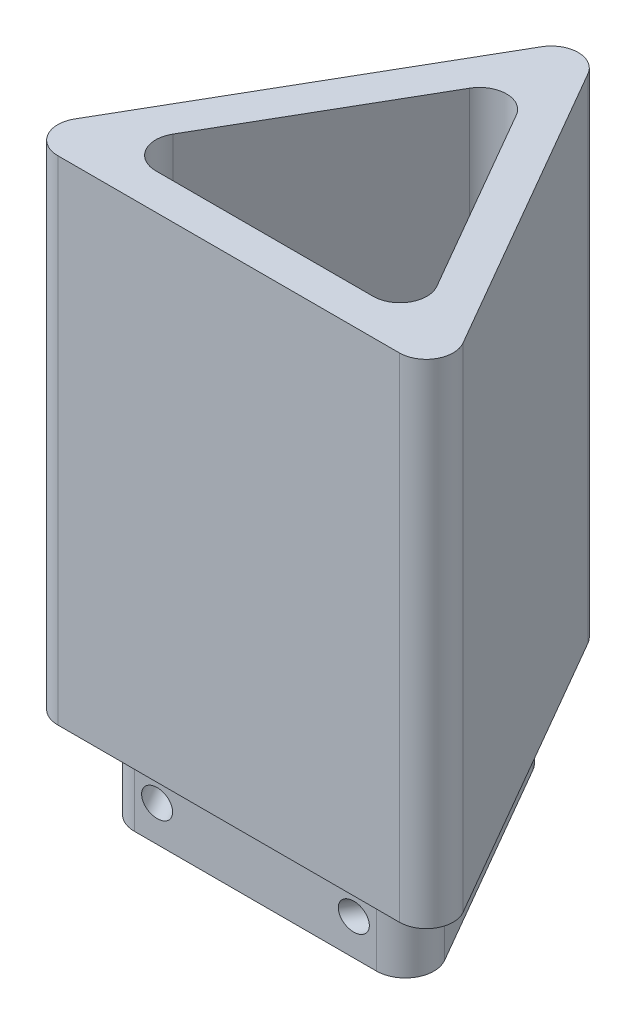
ISO-10303-21;
HEADER;
FILE_DESCRIPTION(('STEP AP214'),'2;1');
FILE_NAME('part.step','',(''),(''),'','','');
FILE_SCHEMA(('AUTOMOTIVE_DESIGN { 1 0 10303 214 1 1 1 1 }'));
ENDSEC;
DATA;
#1=APPLICATION_CONTEXT('core data for automotive mechanical design processes');
#2=APPLICATION_PROTOCOL_DEFINITION('international standard','automotive_design',2000,#1);
#3=PRODUCT_CONTEXT('',#1,'mechanical');
#4=PRODUCT('Part','Part','',(#3));
#5=PRODUCT_RELATED_PRODUCT_CATEGORY('part','',(#4));
#6=PRODUCT_DEFINITION_FORMATION('','',#4);
#7=PRODUCT_DEFINITION_CONTEXT('part definition',#1,'design');
#8=PRODUCT_DEFINITION('design','',#6,#7);
#9=PRODUCT_DEFINITION_SHAPE('','',#8);
#10=(LENGTH_UNIT() NAMED_UNIT(*) SI_UNIT(.MILLI.,.METRE.));
#11=(NAMED_UNIT(*) PLANE_ANGLE_UNIT() SI_UNIT($,.RADIAN.));
#12=(NAMED_UNIT(*) SI_UNIT($,.STERADIAN.) SOLID_ANGLE_UNIT());
#13=UNCERTAINTY_MEASURE_WITH_UNIT(LENGTH_MEASURE(1.E-05),#10,'distance_accuracy_value','');
#14=(GEOMETRIC_REPRESENTATION_CONTEXT(3) GLOBAL_UNCERTAINTY_ASSIGNED_CONTEXT((#13)) GLOBAL_UNIT_ASSIGNED_CONTEXT((#10,
#11,#12)) REPRESENTATION_CONTEXT('',''));
#15=CARTESIAN_POINT('',(0.,0.,0.));
#16=DIRECTION('',(0.,0.,1.));
#17=DIRECTION('',(1.,0.,0.));
#18=AXIS2_PLACEMENT_3D('',#15,#16,#17);
#19=CARTESIAN_POINT('',(0.,14.,0.));
#20=DIRECTION('',(0.,1.,0.));
#21=DIRECTION('',(0.,0.,1.));
#22=AXIS2_PLACEMENT_3D('',#19,#20,#21);
#23=PLANE('',#22);
#24=DIRECTION('',(-0.5,0.,-0.866025403784439));
#25=VECTOR('',#24,1.);
#26=CARTESIAN_POINT('',(-2.59807621135331,14.,-18.5));
#27=LINE('',#26,#25);
#28=CARTESIAN_POINT('',(12.1243556529822,14.,7.));
#29=VERTEX_POINT('',#28);
#30=CARTESIAN_POINT('',(0.,14.,-14.));
#31=VERTEX_POINT('',#30);
#32=EDGE_CURVE('E61',#29,#31,#27,.T.);
#33=ORIENTED_EDGE('',*,*,#32,.T.);
#34=DIRECTION('',(-0.5,0.,0.866025403784439));
#35=VECTOR('',#34,1.);
#36=CARTESIAN_POINT('',(-14.7224318643355,14.,11.5));
#37=LINE('',#36,#35);
#38=CARTESIAN_POINT('',(-12.1243556529821,14.,7.));
#39=VERTEX_POINT('',#38);
#40=EDGE_CURVE('E433',#31,#39,#37,.T.);
#41=ORIENTED_EDGE('',*,*,#40,.T.);
#42=DIRECTION('',(1.,0.,0.));
#43=VECTOR('',#42,1.);
#44=CARTESIAN_POINT('',(17.3205080756888,14.,7.));
#45=LINE('',#44,#43);
#46=EDGE_CURVE('E65',#39,#29,#45,.T.);
#47=ORIENTED_EDGE('',*,*,#46,.T.);
#48=EDGE_LOOP('',(#33,#41,#47));
#49=FACE_BOUND('',#48,.T.);
#50=DIRECTION('',(-0.5,0.,0.866025403784439));
#51=VECTOR('',#50,1.);
#52=CARTESIAN_POINT('',(0.,14.,-12.));
#53=LINE('',#52,#51);
#54=CARTESIAN_POINT('',(0.,14.,-12.));
#55=VERTEX_POINT('',#54);
#56=CARTESIAN_POINT('',(-10.3923048454133,14.,6.));
#57=VERTEX_POINT('',#56);
#58=EDGE_CURVE('E264',#55,#57,#53,.T.);
#59=ORIENTED_EDGE('',*,*,#58,.F.);
#60=DIRECTION('',(-0.500000000000001,0.,-0.866025403784438));
#61=VECTOR('',#60,1.);
#62=CARTESIAN_POINT('',(10.3923048454133,14.,5.99999999999999));
#63=LINE('',#62,#61);
#64=CARTESIAN_POINT('',(10.3923048454133,14.,5.99999999999999));
#65=VERTEX_POINT('',#64);
#66=EDGE_CURVE('E260',#65,#55,#63,.T.);
#67=ORIENTED_EDGE('',*,*,#66,.F.);
#68=DIRECTION('',(1.,0.,0.));
#69=VECTOR('',#68,1.);
#70=CARTESIAN_POINT('',(-10.3923048454133,14.,6.));
#71=LINE('',#70,#69);
#72=EDGE_CURVE('E268',#57,#65,#71,.T.);
#73=ORIENTED_EDGE('',*,*,#72,.F.);
#74=EDGE_LOOP('',(#59,#67,#73));
#75=FACE_BOUND('',#74,.T.);
#76=ADVANCED_FACE('F43',(#49,#75),#23,.T.);
#77=CARTESIAN_POINT('',(0.,0.,0.));
#78=DIRECTION('',(0.,1.,0.));
#79=DIRECTION('',(0.,0.,1.));
#80=AXIS2_PLACEMENT_3D('',#77,#78,#79);
#81=PLANE('',#80);
#82=DIRECTION('',(-0.5,0.,0.866025403784439));
#83=VECTOR('',#82,1.);
#84=CARTESIAN_POINT('',(0.,0.,-22.));
#85=LINE('',#84,#83);
#86=CARTESIAN_POINT('',(-2.7712812921102,0.,-17.2));
#87=VERTEX_POINT('',#86);
#88=CARTESIAN_POINT('',(-16.2812775911475,0.,6.2));
#89=VERTEX_POINT('',#88);
#90=EDGE_CURVE('E324',#87,#89,#85,.T.);
#91=ORIENTED_EDGE('',*,*,#90,.F.);
#92=CARTESIAN_POINT('',(0.,0.,-15.6));
#93=DIRECTION('',(0.,1.,0.));
#94=DIRECTION('',(0.,0.,1.));
#95=AXIS2_PLACEMENT_3D('',#92,#93,#94);
#96=CIRCLE('',#95,3.2);
#97=CARTESIAN_POINT('',(2.7712812921102,0.,-17.2));
#98=VERTEX_POINT('',#97);
#99=EDGE_CURVE('E343',#87,#98,#96,.F.);
#100=ORIENTED_EDGE('',*,*,#99,.T.);
#101=DIRECTION('',(-0.5,0.,-0.866025403784438));
#102=VECTOR('',#101,1.);
#103=CARTESIAN_POINT('',(19.0525588832577,0.,11.));
#104=LINE('',#103,#102);
#105=CARTESIAN_POINT('',(16.2812775911475,0.,6.20000000000001));
#106=VERTEX_POINT('',#105);
#107=EDGE_CURVE('E306',#106,#98,#104,.T.);
#108=ORIENTED_EDGE('',*,*,#107,.F.);
#109=CARTESIAN_POINT('',(13.5099962990373,0.,7.80000000000001));
#110=DIRECTION('',(0.,1.,0.));
#111=DIRECTION('',(0.,0.,1.));
#112=AXIS2_PLACEMENT_3D('',#109,#110,#111);
#113=CIRCLE('',#112,3.2);
#114=CARTESIAN_POINT('',(13.5099962990372,0.,11.));
#115=VERTEX_POINT('',#114);
#116=EDGE_CURVE('E340',#106,#115,#113,.F.);
#117=ORIENTED_EDGE('',*,*,#116,.T.);
#118=DIRECTION('',(1.,0.,0.));
#119=VECTOR('',#118,1.);
#120=CARTESIAN_POINT('',(-19.0525588832577,0.,11.));
#121=LINE('',#120,#119);
#122=CARTESIAN_POINT('',(-13.5099962990372,0.,11.));
#123=VERTEX_POINT('',#122);
#124=EDGE_CURVE('E312',#123,#115,#121,.T.);
#125=ORIENTED_EDGE('',*,*,#124,.F.);
#126=CARTESIAN_POINT('',(-13.5099962990372,0.,7.8));
#127=DIRECTION('',(0.,1.,0.));
#128=DIRECTION('',(0.,0.,1.));
#129=AXIS2_PLACEMENT_3D('',#126,#127,#128);
#130=CIRCLE('',#129,3.2);
#131=EDGE_CURVE('E337',#123,#89,#130,.F.);
#132=ORIENTED_EDGE('',*,*,#131,.T.);
#133=EDGE_LOOP('',(#91,#100,#108,#117,#125,#132));
#134=FACE_BOUND('',#133,.T.);
#135=DIRECTION('',(-0.5,0.,-0.866025403784438));
#136=VECTOR('',#135,1.);
#137=CARTESIAN_POINT('',(10.3923048454133,0.,6.));
#138=LINE('',#137,#136);
#139=CARTESIAN_POINT('',(10.3923048454133,0.,6.));
#140=VERTEX_POINT('',#139);
#141=CARTESIAN_POINT('',(0.,0.,-12.));
#142=VERTEX_POINT('',#141);
#143=EDGE_CURVE('E283',#140,#142,#138,.T.);
#144=ORIENTED_EDGE('',*,*,#143,.T.);
#145=DIRECTION('',(-0.5,0.,0.866025403784439));
#146=VECTOR('',#145,1.);
#147=CARTESIAN_POINT('',(0.,0.,-12.));
#148=LINE('',#147,#146);
#149=CARTESIAN_POINT('',(-10.3923048454133,0.,6.));
#150=VERTEX_POINT('',#149);
#151=EDGE_CURVE('E287',#142,#150,#148,.T.);
#152=ORIENTED_EDGE('',*,*,#151,.T.);
#153=DIRECTION('',(1.,0.,0.));
#154=VECTOR('',#153,1.);
#155=CARTESIAN_POINT('',(-10.3923048454133,0.,6.));
#156=LINE('',#155,#154);
#157=EDGE_CURVE('E291',#150,#140,#156,.T.);
#158=ORIENTED_EDGE('',*,*,#157,.T.);
#159=EDGE_LOOP('',(#144,#152,#158));
#160=FACE_BOUND('',#159,.T.);
#161=ADVANCED_FACE('F517',(#134,#160),#81,.F.);
#162=CARTESIAN_POINT('',(19.0525588832577,9.,11.));
#163=DIRECTION('',(-0.866025403784438,0.,0.5));
#164=DIRECTION('',(0.5,0.,0.866025403784439));
#165=AXIS2_PLACEMENT_3D('',#162,#163,#164);
#166=PLANE('',#165);
#167=CARTESIAN_POINT('',(15.0111069989301,4.,3.99999999999978));
#168=DIRECTION('',(-0.866025403784438,0.,0.5));
#169=DIRECTION('',(0.5,0.,0.866025403784439));
#170=AXIS2_PLACEMENT_3D('',#167,#168,#169);
#171=ELLIPSE('',#170,1.73205080756887,1.5);
#172=CARTESIAN_POINT('',(15.8771324027146,4.,5.49999999999977));
#173=VERTEX_POINT('',#172);
#174=EDGE_CURVE('E251',#173,#173,#171,.T.);
#175=ORIENTED_EDGE('',*,*,#174,.T.);
#176=EDGE_LOOP('',(#175));
#177=FACE_BOUND('',#176,.T.);
#178=CARTESIAN_POINT('',(4.04145188432752,4.,-14.9999999999998));
#179=DIRECTION('',(-0.866025403784438,0.,0.5));
#180=DIRECTION('',(0.5,0.,0.866025403784439));
#181=AXIS2_PLACEMENT_3D('',#178,#179,#180);
#182=ELLIPSE('',#181,1.73205080756888,1.5);
#183=CARTESIAN_POINT('',(4.90747728811196,4.,-13.4999999999998));
#184=VERTEX_POINT('',#183);
#185=EDGE_CURVE('E256',#184,#184,#182,.T.);
#186=ORIENTED_EDGE('',*,*,#185,.T.);
#187=EDGE_LOOP('',(#186));
#188=FACE_BOUND('',#187,.T.);
#189=ORIENTED_EDGE('',*,*,#107,.T.);
#190=DIRECTION('',(0.,-1.,0.));
#191=VECTOR('',#190,1.);
#192=CARTESIAN_POINT('',(2.7712812921102,9.,-17.2));
#193=LINE('',#192,#191);
#194=CARTESIAN_POINT('',(2.7712812921102,9.,-17.2));
#195=VERTEX_POINT('',#194);
#196=EDGE_CURVE('E350',#98,#195,#193,.F.);
#197=ORIENTED_EDGE('',*,*,#196,.T.);
#198=DIRECTION('',(-0.5,0.,-0.866025403784438));
#199=VECTOR('',#198,1.);
#200=CARTESIAN_POINT('',(19.0525588832577,9.,11.));
#201=LINE('',#200,#199);
#202=CARTESIAN_POINT('',(16.2812775911475,9.,6.20000000000001));
#203=VERTEX_POINT('',#202);
#204=EDGE_CURVE('E307',#203,#195,#201,.T.);
#205=ORIENTED_EDGE('',*,*,#204,.F.);
#206=DIRECTION('',(0.,-1.,0.));
#207=VECTOR('',#206,1.);
#208=CARTESIAN_POINT('',(16.2812775911475,9.,6.20000000000001));
#209=LINE('',#208,#207);
#210=EDGE_CURVE('E346',#203,#106,#209,.T.);
#211=ORIENTED_EDGE('',*,*,#210,.T.);
#212=EDGE_LOOP('',(#189,#197,#205,#211));
#213=FACE_BOUND('',#212,.T.);
#214=ADVANCED_FACE('F531',(#177,#188,#213),#166,.F.);
#215=CARTESIAN_POINT('',(0.,9.,-22.));
#216=DIRECTION('',(0.866025403784439,0.,0.5));
#217=DIRECTION('',(0.5,0.,-0.866025403784439));
#218=AXIS2_PLACEMENT_3D('',#215,#216,#217);
#219=PLANE('',#218);
#220=CARTESIAN_POINT('',(-15.0111069989301,4.,3.99999999999972));
#221=DIRECTION('',(0.866025403784439,0.,0.5));
#222=DIRECTION('',(0.5,0.,-0.866025403784439));
#223=AXIS2_PLACEMENT_3D('',#220,#221,#222);
#224=ELLIPSE('',#223,1.73205080756889,1.5);
#225=CARTESIAN_POINT('',(-14.1450815951457,4.,2.49999999999972));
#226=VERTEX_POINT('',#225);
#227=EDGE_CURVE('E246',#226,#226,#224,.T.);
#228=ORIENTED_EDGE('',*,*,#227,.T.);
#229=EDGE_LOOP('',(#228));
#230=FACE_BOUND('',#229,.T.);
#231=CARTESIAN_POINT('',(-4.04145188432751,4.,-14.9999999999998));
#232=DIRECTION('',(0.866025403784439,0.,0.5));
#233=DIRECTION('',(0.5,0.,-0.866025403784439));
#234=AXIS2_PLACEMENT_3D('',#231,#232,#233);
#235=ELLIPSE('',#234,1.73205080756888,1.5);
#236=CARTESIAN_POINT('',(-3.17542648054308,4.,-16.4999999999998));
#237=VERTEX_POINT('',#236);
#238=EDGE_CURVE('E255',#237,#237,#235,.T.);
#239=ORIENTED_EDGE('',*,*,#238,.T.);
#240=EDGE_LOOP('',(#239));
#241=FACE_BOUND('',#240,.T.);
#242=DIRECTION('',(-0.5,0.,0.866025403784439));
#243=VECTOR('',#242,1.);
#244=CARTESIAN_POINT('',(0.,9.,-22.));
#245=LINE('',#244,#243);
#246=CARTESIAN_POINT('',(-2.7712812921102,9.,-17.2));
#247=VERTEX_POINT('',#246);
#248=CARTESIAN_POINT('',(-16.2812775911475,9.,6.2));
#249=VERTEX_POINT('',#248);
#250=EDGE_CURVE('E311',#247,#249,#245,.T.);
#251=ORIENTED_EDGE('',*,*,#250,.F.);
#252=DIRECTION('',(0.,-1.,0.));
#253=VECTOR('',#252,1.);
#254=CARTESIAN_POINT('',(-2.7712812921102,9.,-17.2));
#255=LINE('',#254,#253);
#256=EDGE_CURVE('E333',#247,#87,#255,.T.);
#257=ORIENTED_EDGE('',*,*,#256,.T.);
#258=ORIENTED_EDGE('',*,*,#90,.T.);
#259=DIRECTION('',(0.,-1.,0.));
#260=VECTOR('',#259,1.);
#261=CARTESIAN_POINT('',(-16.2812775911475,9.,6.2));
#262=LINE('',#261,#260);
#263=EDGE_CURVE('E320',#89,#249,#262,.F.);
#264=ORIENTED_EDGE('',*,*,#263,.T.);
#265=EDGE_LOOP('',(#251,#257,#258,#264));
#266=FACE_BOUND('',#265,.T.);
#267=ADVANCED_FACE('F537',(#230,#241,#266),#219,.F.);
#268=CARTESIAN_POINT('',(-19.0525588832577,9.,11.));
#269=DIRECTION('',(0.,0.,-1.));
#270=DIRECTION('',(-1.,0.,0.));
#271=AXIS2_PLACEMENT_3D('',#268,#269,#270);
#272=PLANE('',#271);
#273=CARTESIAN_POINT('',(10.9696551146026,4.,11.));
#274=DIRECTION('',(0.,0.,-1.));
#275=DIRECTION('',(-1.,0.,0.));
#276=AXIS2_PLACEMENT_3D('',#273,#274,#275);
#277=ELLIPSE('',#276,1.73205080756888,1.5);
#278=CARTESIAN_POINT('',(9.23760430703371,4.,11.));
#279=VERTEX_POINT('',#278);
#280=EDGE_CURVE('E250',#279,#279,#277,.T.);
#281=ORIENTED_EDGE('',*,*,#280,.T.);
#282=EDGE_LOOP('',(#281));
#283=FACE_BOUND('',#282,.T.);
#284=CARTESIAN_POINT('',(-10.9696551146027,4.,11.));
#285=DIRECTION('',(0.,0.,-1.));
#286=DIRECTION('',(-1.,0.,0.));
#287=AXIS2_PLACEMENT_3D('',#284,#285,#286);
#288=ELLIPSE('',#287,1.73205080756887,1.5);
#289=CARTESIAN_POINT('',(-12.7017059221715,4.,11.));
#290=VERTEX_POINT('',#289);
#291=EDGE_CURVE('E245',#290,#290,#288,.T.);
#292=ORIENTED_EDGE('',*,*,#291,.T.);
#293=EDGE_LOOP('',(#292));
#294=FACE_BOUND('',#293,.T.);
#295=ORIENTED_EDGE('',*,*,#124,.T.);
#296=DIRECTION('',(0.,-1.,0.));
#297=VECTOR('',#296,1.);
#298=CARTESIAN_POINT('',(13.5099962990372,9.,11.));
#299=LINE('',#298,#297);
#300=CARTESIAN_POINT('',(13.5099962990372,9.,11.));
#301=VERTEX_POINT('',#300);
#302=EDGE_CURVE('E357',#115,#301,#299,.F.);
#303=ORIENTED_EDGE('',*,*,#302,.T.);
#304=DIRECTION('',(1.,0.,0.));
#305=VECTOR('',#304,1.);
#306=CARTESIAN_POINT('',(-19.0525588832577,9.,11.));
#307=LINE('',#306,#305);
#308=CARTESIAN_POINT('',(-13.5099962990372,9.,11.));
#309=VERTEX_POINT('',#308);
#310=EDGE_CURVE('E316',#309,#301,#307,.T.);
#311=ORIENTED_EDGE('',*,*,#310,.F.);
#312=DIRECTION('',(0.,-1.,0.));
#313=VECTOR('',#312,1.);
#314=CARTESIAN_POINT('',(-13.5099962990372,9.,11.));
#315=LINE('',#314,#313);
#316=EDGE_CURVE('E353',#309,#123,#315,.T.);
#317=ORIENTED_EDGE('',*,*,#316,.T.);
#318=EDGE_LOOP('',(#295,#303,#311,#317));
#319=FACE_BOUND('',#318,.T.);
#320=ADVANCED_FACE('F544',(#283,#294,#319),#272,.F.);
#321=CARTESIAN_POINT('',(10.3923048454133,9.,6.));
#322=DIRECTION('',(-0.866025403784438,0.,0.5));
#323=DIRECTION('',(0.5,0.,0.866025403784438));
#324=AXIS2_PLACEMENT_3D('',#321,#322,#323);
#325=PLANE('',#324);
#326=ORIENTED_EDGE('',*,*,#143,.F.);
#327=DIRECTION('',(0.,-1.,0.));
#328=VECTOR('',#327,1.);
#329=CARTESIAN_POINT('',(10.3923048454133,9.,6.));
#330=LINE('',#329,#328);
#331=EDGE_CURVE('E295',#65,#140,#330,.T.);
#332=ORIENTED_EDGE('',*,*,#331,.F.);
#333=ORIENTED_EDGE('',*,*,#66,.T.);
#334=DIRECTION('',(0.,-1.,0.));
#335=VECTOR('',#334,1.);
#336=CARTESIAN_POINT('',(0.,9.,-12.));
#337=LINE('',#336,#335);
#338=EDGE_CURVE('E302',#55,#142,#337,.T.);
#339=ORIENTED_EDGE('',*,*,#338,.T.);
#340=EDGE_LOOP('',(#326,#332,#333,#339));
#341=FACE_BOUND('',#340,.T.);
#342=ADVANCED_FACE('F526',(#341),#325,.T.);
#343=CARTESIAN_POINT('',(0.,9.,-12.));
#344=DIRECTION('',(0.866025403784439,0.,0.5));
#345=DIRECTION('',(0.5,0.,-0.866025403784439));
#346=AXIS2_PLACEMENT_3D('',#343,#344,#345);
#347=PLANE('',#346);
#348=ORIENTED_EDGE('',*,*,#151,.F.);
#349=ORIENTED_EDGE('',*,*,#338,.F.);
#350=ORIENTED_EDGE('',*,*,#58,.T.);
#351=DIRECTION('',(0.,-1.,0.));
#352=VECTOR('',#351,1.);
#353=CARTESIAN_POINT('',(-10.3923048454133,9.,6.));
#354=LINE('',#353,#352);
#355=EDGE_CURVE('E299',#57,#150,#354,.T.);
#356=ORIENTED_EDGE('',*,*,#355,.T.);
#357=EDGE_LOOP('',(#348,#349,#350,#356));
#358=FACE_BOUND('',#357,.T.);
#359=ADVANCED_FACE('F523',(#358),#347,.T.);
#360=CARTESIAN_POINT('',(-10.3923048454133,9.,6.));
#361=DIRECTION('',(0.,0.,-1.));
#362=DIRECTION('',(-1.,0.,0.));
#363=AXIS2_PLACEMENT_3D('',#360,#361,#362);
#364=PLANE('',#363);
#365=ORIENTED_EDGE('',*,*,#157,.F.);
#366=ORIENTED_EDGE('',*,*,#355,.F.);
#367=ORIENTED_EDGE('',*,*,#72,.T.);
#368=ORIENTED_EDGE('',*,*,#331,.T.);
#369=EDGE_LOOP('',(#365,#366,#367,#368));
#370=FACE_BOUND('',#369,.T.);
#371=ADVANCED_FACE('F528',(#370),#364,.T.);
#372=CARTESIAN_POINT('',(0.,9.,0.));
#373=DIRECTION('',(0.,1.,0.));
#374=DIRECTION('',(0.,0.,1.));
#375=AXIS2_PLACEMENT_3D('',#372,#373,#374);
#376=PLANE('',#375);
#377=DIRECTION('',(1.,0.,0.));
#378=VECTOR('',#377,1.);
#379=CARTESIAN_POINT('',(-24.2487113059643,9.,14.));
#380=LINE('',#379,#378);
#381=CARTESIAN_POINT('',(-19.0525588832576,9.,14.));
#382=VERTEX_POINT('',#381);
#383=CARTESIAN_POINT('',(19.0525588832577,9.,14.));
#384=VERTEX_POINT('',#383);
#385=EDGE_CURVE('E279',#382,#384,#380,.T.);
#386=ORIENTED_EDGE('',*,*,#385,.F.);
#387=CARTESIAN_POINT('',(-19.0525588832576,9.,11.));
#388=DIRECTION('',(0.,1.,0.));
#389=DIRECTION('',(0.,0.,1.));
#390=AXIS2_PLACEMENT_3D('',#387,#388,#389);
#391=CIRCLE('',#390,3.);
#392=CARTESIAN_POINT('',(-21.650635094611,9.,9.49999999999998));
#393=VERTEX_POINT('',#392);
#394=EDGE_CURVE('E207',#382,#393,#391,.F.);
#395=ORIENTED_EDGE('',*,*,#394,.T.);
#396=DIRECTION('',(-0.5,0.,0.866025403784439));
#397=VECTOR('',#396,1.);
#398=CARTESIAN_POINT('',(0.,9.,-28.));
#399=LINE('',#398,#397);
#400=CARTESIAN_POINT('',(-2.59807621135332,9.,-23.5));
#401=VERTEX_POINT('',#400);
#402=EDGE_CURVE('E276',#401,#393,#399,.T.);
#403=ORIENTED_EDGE('',*,*,#402,.F.);
#404=CARTESIAN_POINT('',(0.,9.,-22.));
#405=DIRECTION('',(0.,1.,0.));
#406=DIRECTION('',(0.,0.,1.));
#407=AXIS2_PLACEMENT_3D('',#404,#405,#406);
#408=CIRCLE('',#407,3.);
#409=CARTESIAN_POINT('',(2.5980762113533,9.,-23.5));
#410=VERTEX_POINT('',#409);
#411=EDGE_CURVE('E201',#401,#410,#408,.F.);
#412=ORIENTED_EDGE('',*,*,#411,.T.);
#413=DIRECTION('',(-0.5,0.,-0.866025403784439));
#414=VECTOR('',#413,1.);
#415=CARTESIAN_POINT('',(24.2487113059643,9.,14.));
#416=LINE('',#415,#414);
#417=CARTESIAN_POINT('',(21.650635094611,9.,9.50000000000001));
#418=VERTEX_POINT('',#417);
#419=EDGE_CURVE('E272',#418,#410,#416,.T.);
#420=ORIENTED_EDGE('',*,*,#419,.F.);
#421=CARTESIAN_POINT('',(19.0525588832577,9.,11.));
#422=DIRECTION('',(0.,1.,0.));
#423=DIRECTION('',(0.,0.,1.));
#424=AXIS2_PLACEMENT_3D('',#421,#422,#423);
#425=CIRCLE('',#424,3.);
#426=EDGE_CURVE('E385',#418,#384,#425,.F.);
#427=ORIENTED_EDGE('',*,*,#426,.T.);
#428=EDGE_LOOP('',(#386,#395,#403,#412,#420,#427));
#429=FACE_BOUND('',#428,.T.);
#430=ORIENTED_EDGE('',*,*,#250,.T.);
#431=CARTESIAN_POINT('',(-13.5099962990372,9.,7.8));
#432=DIRECTION('',(0.,1.,0.));
#433=DIRECTION('',(0.,0.,1.));
#434=AXIS2_PLACEMENT_3D('',#431,#432,#433);
#435=CIRCLE('',#434,3.2);
#436=EDGE_CURVE('E366',#249,#309,#435,.T.);
#437=ORIENTED_EDGE('',*,*,#436,.T.);
#438=ORIENTED_EDGE('',*,*,#310,.T.);
#439=CARTESIAN_POINT('',(13.5099962990373,9.,7.80000000000001));
#440=DIRECTION('',(0.,1.,0.));
#441=DIRECTION('',(0.,0.,1.));
#442=AXIS2_PLACEMENT_3D('',#439,#440,#441);
#443=CIRCLE('',#442,3.2);
#444=EDGE_CURVE('E363',#301,#203,#443,.T.);
#445=ORIENTED_EDGE('',*,*,#444,.T.);
#446=ORIENTED_EDGE('',*,*,#204,.T.);
#447=CARTESIAN_POINT('',(0.,9.,-15.6));
#448=DIRECTION('',(0.,1.,0.));
#449=DIRECTION('',(0.,0.,1.));
#450=AXIS2_PLACEMENT_3D('',#447,#448,#449);
#451=CIRCLE('',#450,3.2);
#452=EDGE_CURVE('E360',#195,#247,#451,.T.);
#453=ORIENTED_EDGE('',*,*,#452,.T.);
#454=EDGE_LOOP('',(#430,#437,#438,#445,#446,#453));
#455=FACE_BOUND('',#454,.T.);
#456=ADVANCED_FACE('F623',(#429,#455),#376,.F.);
#457=CARTESIAN_POINT('',(24.2487113059643,14.,14.));
#458=DIRECTION('',(-0.866025403784438,0.,0.5));
#459=DIRECTION('',(0.5,0.,0.866025403784438));
#460=AXIS2_PLACEMENT_3D('',#457,#458,#459);
#461=PLANE('',#460);
#462=ORIENTED_EDGE('',*,*,#419,.T.);
#463=DIRECTION('',(0.,-1.,0.));
#464=VECTOR('',#463,1.);
#465=CARTESIAN_POINT('',(2.59807621135331,14.,-23.5));
#466=LINE('',#465,#464);
#467=CARTESIAN_POINT('',(2.5980762113533,64.,-23.5));
#468=VERTEX_POINT('',#467);
#469=EDGE_CURVE('E398',#410,#468,#466,.F.);
#470=ORIENTED_EDGE('',*,*,#469,.T.);
#471=DIRECTION('',(-0.5,0.,-0.866025403784438));
#472=VECTOR('',#471,1.);
#473=CARTESIAN_POINT('',(21.650635094611,64.,9.50000000000001));
#474=LINE('',#473,#472);
#475=CARTESIAN_POINT('',(21.650635094611,64.,9.50000000000001));
#476=VERTEX_POINT('',#475);
#477=EDGE_CURVE('E224',#476,#468,#474,.T.);
#478=ORIENTED_EDGE('',*,*,#477,.F.);
#479=DIRECTION('',(0.,-1.,0.));
#480=VECTOR('',#479,1.);
#481=CARTESIAN_POINT('',(21.650635094611,14.,9.50000000000001));
#482=LINE('',#481,#480);
#483=EDGE_CURVE('E394',#476,#418,#482,.T.);
#484=ORIENTED_EDGE('',*,*,#483,.T.);
#485=EDGE_LOOP('',(#462,#470,#478,#484));
#486=FACE_BOUND('',#485,.T.);
#487=ADVANCED_FACE('F626',(#486),#461,.F.);
#488=CARTESIAN_POINT('',(0.,14.,-28.));
#489=DIRECTION('',(0.866025403784439,0.,0.5));
#490=DIRECTION('',(0.5,0.,-0.866025403784439));
#491=AXIS2_PLACEMENT_3D('',#488,#489,#490);
#492=PLANE('',#491);
#493=ORIENTED_EDGE('',*,*,#402,.T.);
#494=DIRECTION('',(0.,-1.,0.));
#495=VECTOR('',#494,1.);
#496=CARTESIAN_POINT('',(-21.650635094611,14.,9.5));
#497=LINE('',#496,#495);
#498=CARTESIAN_POINT('',(-21.650635094611,64.,9.49999999999998));
#499=VERTEX_POINT('',#498);
#500=EDGE_CURVE('E206',#393,#499,#497,.F.);
#501=ORIENTED_EDGE('',*,*,#500,.T.);
#502=DIRECTION('',(-0.5,0.,0.866025403784439));
#503=VECTOR('',#502,1.);
#504=CARTESIAN_POINT('',(-2.59807621135332,64.,-23.5));
#505=LINE('',#504,#503);
#506=CARTESIAN_POINT('',(-2.59807621135332,64.,-23.5));
#507=VERTEX_POINT('',#506);
#508=EDGE_CURVE('E210',#507,#499,#505,.T.);
#509=ORIENTED_EDGE('',*,*,#508,.F.);
#510=DIRECTION('',(0.,-1.,0.));
#511=VECTOR('',#510,1.);
#512=CARTESIAN_POINT('',(-2.59807621135332,14.,-23.5));
#513=LINE('',#512,#511);
#514=EDGE_CURVE('E195',#507,#401,#513,.T.);
#515=ORIENTED_EDGE('',*,*,#514,.T.);
#516=EDGE_LOOP('',(#493,#501,#509,#515));
#517=FACE_BOUND('',#516,.T.);
#518=ADVANCED_FACE('F211',(#517),#492,.F.);
#519=CARTESIAN_POINT('',(-24.2487113059643,14.,14.));
#520=DIRECTION('',(0.,0.,-1.));
#521=DIRECTION('',(-1.,0.,0.));
#522=AXIS2_PLACEMENT_3D('',#519,#520,#521);
#523=PLANE('',#522);
#524=DIRECTION('',(0.,-1.,0.));
#525=VECTOR('',#524,1.);
#526=CARTESIAN_POINT('',(19.0525588832577,14.,14.));
#527=LINE('',#526,#525);
#528=CARTESIAN_POINT('',(19.0525588832577,64.,14.));
#529=VERTEX_POINT('',#528);
#530=EDGE_CURVE('E369',#384,#529,#527,.F.);
#531=ORIENTED_EDGE('',*,*,#530,.T.);
#532=DIRECTION('',(1.,0.,0.));
#533=VECTOR('',#532,1.);
#534=CARTESIAN_POINT('',(-19.0525588832576,64.,14.));
#535=LINE('',#534,#533);
#536=CARTESIAN_POINT('',(-19.0525588832576,64.,14.));
#537=VERTEX_POINT('',#536);
#538=EDGE_CURVE('E236',#537,#529,#535,.T.);
#539=ORIENTED_EDGE('',*,*,#538,.F.);
#540=DIRECTION('',(0.,-1.,0.));
#541=VECTOR('',#540,1.);
#542=CARTESIAN_POINT('',(-19.0525588832576,14.,14.));
#543=LINE('',#542,#541);
#544=EDGE_CURVE('E381',#537,#382,#543,.T.);
#545=ORIENTED_EDGE('',*,*,#544,.T.);
#546=ORIENTED_EDGE('',*,*,#385,.T.);
#547=EDGE_LOOP('',(#531,#539,#545,#546));
#548=FACE_BOUND('',#547,.T.);
#549=ADVANCED_FACE('F555',(#548),#523,.F.);
#550=CARTESIAN_POINT('',(0.,9.,-15.6));
#551=DIRECTION('',(0.,-1.,0.));
#552=DIRECTION('',(0.,0.,-1.));
#553=AXIS2_PLACEMENT_3D('',#550,#551,#552);
#554=CYLINDRICAL_SURFACE('',#553,3.2);
#555=ORIENTED_EDGE('',*,*,#452,.F.);
#556=ORIENTED_EDGE('',*,*,#196,.F.);
#557=ORIENTED_EDGE('',*,*,#99,.F.);
#558=ORIENTED_EDGE('',*,*,#256,.F.);
#559=EDGE_LOOP('',(#555,#556,#557,#558));
#560=FACE_BOUND('',#559,.T.);
#561=ADVANCED_FACE('F551',(#560),#554,.T.);
#562=CARTESIAN_POINT('',(13.5099962990373,9.,7.80000000000001));
#563=DIRECTION('',(0.,-1.,0.));
#564=DIRECTION('',(0.,0.,-1.));
#565=AXIS2_PLACEMENT_3D('',#562,#563,#564);
#566=CYLINDRICAL_SURFACE('',#565,3.2);
#567=ORIENTED_EDGE('',*,*,#444,.F.);
#568=ORIENTED_EDGE('',*,*,#302,.F.);
#569=ORIENTED_EDGE('',*,*,#116,.F.);
#570=ORIENTED_EDGE('',*,*,#210,.F.);
#571=EDGE_LOOP('',(#567,#568,#569,#570));
#572=FACE_BOUND('',#571,.T.);
#573=ADVANCED_FACE('F554',(#572),#566,.T.);
#574=CARTESIAN_POINT('',(-13.5099962990372,9.,7.8));
#575=DIRECTION('',(0.,-1.,0.));
#576=DIRECTION('',(0.,0.,-1.));
#577=AXIS2_PLACEMENT_3D('',#574,#575,#576);
#578=CYLINDRICAL_SURFACE('',#577,3.2);
#579=ORIENTED_EDGE('',*,*,#436,.F.);
#580=ORIENTED_EDGE('',*,*,#263,.F.);
#581=ORIENTED_EDGE('',*,*,#131,.F.);
#582=ORIENTED_EDGE('',*,*,#316,.F.);
#583=EDGE_LOOP('',(#579,#580,#581,#582));
#584=FACE_BOUND('',#583,.T.);
#585=ADVANCED_FACE('F559',(#584),#578,.T.);
#586=CARTESIAN_POINT('',(-10.9999999999998,4.,-14.9999999999998));
#587=DIRECTION('',(1.,0.,0.));
#588=DIRECTION('',(0.,0.,-1.));
#589=AXIS2_PLACEMENT_3D('',#586,#587,#588);
#590=CYLINDRICAL_SURFACE('',#589,1.5);
#591=ORIENTED_EDGE('',*,*,#238,.F.);
#592=EDGE_LOOP('',(#591));
#593=FACE_BOUND('',#592,.T.);
#594=ORIENTED_EDGE('',*,*,#185,.F.);
#595=EDGE_LOOP('',(#594));
#596=FACE_BOUND('',#595,.T.);
#597=ADVANCED_FACE('F563',(#593,#596),#590,.F.);
#598=CARTESIAN_POINT('',(-7.49038105676662,4.,17.0262794416285));
#599=DIRECTION('',(-0.499999999999992,0.,-0.866025403784443));
#600=DIRECTION('',(-0.866025403784443,0.,0.499999999999992));
#601=AXIS2_PLACEMENT_3D('',#598,#599,#600);
#602=CYLINDRICAL_SURFACE('',#601,1.5);
#603=ORIENTED_EDGE('',*,*,#291,.F.);
#604=EDGE_LOOP('',(#603));
#605=FACE_BOUND('',#604,.T.);
#606=ORIENTED_EDGE('',*,*,#227,.F.);
#607=EDGE_LOOP('',(#606));
#608=FACE_BOUND('',#607,.T.);
#609=ADVANCED_FACE('F615',(#605,#608),#602,.F.);
#610=CARTESIAN_POINT('',(18.4903810567663,4.,-2.0262794416287));
#611=DIRECTION('',(-0.500000000000004,0.,0.866025403784436));
#612=DIRECTION('',(0.866025403784436,0.,0.500000000000004));
#613=AXIS2_PLACEMENT_3D('',#610,#611,#612);
#614=CYLINDRICAL_SURFACE('',#613,1.5);
#615=ORIENTED_EDGE('',*,*,#280,.F.);
#616=EDGE_LOOP('',(#615));
#617=FACE_BOUND('',#616,.T.);
#618=ORIENTED_EDGE('',*,*,#174,.F.);
#619=EDGE_LOOP('',(#618));
#620=FACE_BOUND('',#619,.T.);
#621=ADVANCED_FACE('F568',(#617,#620),#614,.F.);
#622=CARTESIAN_POINT('',(-19.0525588832576,14.,11.));
#623=DIRECTION('',(0.,-1.,0.));
#624=DIRECTION('',(0.,0.,-1.));
#625=AXIS2_PLACEMENT_3D('',#622,#623,#624);
#626=CYLINDRICAL_SURFACE('',#625,3.);
#627=ORIENTED_EDGE('',*,*,#544,.F.);
#628=CARTESIAN_POINT('',(-19.0525588832576,64.,11.));
#629=DIRECTION('',(0.,1.,0.));
#630=DIRECTION('',(0.,0.,1.));
#631=AXIS2_PLACEMENT_3D('',#628,#629,#630);
#632=CIRCLE('',#631,3.);
#633=EDGE_CURVE('E217',#499,#537,#632,.T.);
#634=ORIENTED_EDGE('',*,*,#633,.F.);
#635=ORIENTED_EDGE('',*,*,#500,.F.);
#636=ORIENTED_EDGE('',*,*,#394,.F.);
#637=EDGE_LOOP('',(#627,#634,#635,#636));
#638=FACE_BOUND('',#637,.T.);
#639=ADVANCED_FACE('F565',(#638),#626,.T.);
#640=CARTESIAN_POINT('',(0.,14.,-22.));
#641=DIRECTION('',(0.,-1.,0.));
#642=DIRECTION('',(0.,0.,-1.));
#643=AXIS2_PLACEMENT_3D('',#640,#641,#642);
#644=CYLINDRICAL_SURFACE('',#643,3.);
#645=ORIENTED_EDGE('',*,*,#514,.F.);
#646=CARTESIAN_POINT('',(0.,64.,-22.));
#647=DIRECTION('',(0.,1.,0.));
#648=DIRECTION('',(0.,0.,1.));
#649=AXIS2_PLACEMENT_3D('',#646,#647,#648);
#650=CIRCLE('',#649,3.);
#651=EDGE_CURVE('E200',#468,#507,#650,.T.);
#652=ORIENTED_EDGE('',*,*,#651,.F.);
#653=ORIENTED_EDGE('',*,*,#469,.F.);
#654=ORIENTED_EDGE('',*,*,#411,.F.);
#655=EDGE_LOOP('',(#645,#652,#653,#654));
#656=FACE_BOUND('',#655,.T.);
#657=ADVANCED_FACE('F197',(#656),#644,.T.);
#658=CARTESIAN_POINT('',(19.0525588832577,14.,11.));
#659=DIRECTION('',(0.,-1.,0.));
#660=DIRECTION('',(0.,0.,-1.));
#661=AXIS2_PLACEMENT_3D('',#658,#659,#660);
#662=CYLINDRICAL_SURFACE('',#661,3.);
#663=ORIENTED_EDGE('',*,*,#483,.F.);
#664=CARTESIAN_POINT('',(19.0525588832577,64.,11.));
#665=DIRECTION('',(0.,1.,0.));
#666=DIRECTION('',(0.,0.,1.));
#667=AXIS2_PLACEMENT_3D('',#664,#665,#666);
#668=CIRCLE('',#667,3.);
#669=EDGE_CURVE('E240',#529,#476,#668,.T.);
#670=ORIENTED_EDGE('',*,*,#669,.F.);
#671=ORIENTED_EDGE('',*,*,#530,.F.);
#672=ORIENTED_EDGE('',*,*,#426,.F.);
#673=EDGE_LOOP('',(#663,#670,#671,#672));
#674=FACE_BOUND('',#673,.T.);
#675=ADVANCED_FACE('F572',(#674),#662,.T.);
#676=CARTESIAN_POINT('',(0.,64.,-22.));
#677=DIRECTION('',(0.,1.,0.));
#678=DIRECTION('',(0.,0.,1.));
#679=AXIS2_PLACEMENT_3D('',#676,#677,#678);
#680=PLANE('',#679);
#681=ORIENTED_EDGE('',*,*,#651,.T.);
#682=ORIENTED_EDGE('',*,*,#508,.T.);
#683=ORIENTED_EDGE('',*,*,#633,.T.);
#684=ORIENTED_EDGE('',*,*,#538,.T.);
#685=ORIENTED_EDGE('',*,*,#669,.T.);
#686=ORIENTED_EDGE('',*,*,#477,.T.);
#687=EDGE_LOOP('',(#681,#682,#683,#684,#685,#686));
#688=FACE_BOUND('',#687,.T.);
#689=DIRECTION('',(-0.5,0.,0.866025403784439));
#690=VECTOR('',#689,1.);
#691=CARTESIAN_POINT('',(0.,64.,-20.));
#692=LINE('',#691,#690);
#693=CARTESIAN_POINT('',(-2.59807621135331,64.,-15.5));
#694=VERTEX_POINT('',#693);
#695=CARTESIAN_POINT('',(-14.7224318643355,64.,5.49999999999999));
#696=VERTEX_POINT('',#695);
#697=EDGE_CURVE('E230',#694,#696,#692,.T.);
#698=ORIENTED_EDGE('',*,*,#697,.F.);
#699=CARTESIAN_POINT('',(0.,64.,-14.));
#700=DIRECTION('',(0.,1.,0.));
#701=DIRECTION('',(0.,0.,1.));
#702=AXIS2_PLACEMENT_3D('',#699,#700,#701);
#703=CIRCLE('',#702,3.);
#704=CARTESIAN_POINT('',(2.59807621135332,64.,-15.5));
#705=VERTEX_POINT('',#704);
#706=EDGE_CURVE('E11',#694,#705,#703,.F.);
#707=ORIENTED_EDGE('',*,*,#706,.T.);
#708=DIRECTION('',(-0.5,0.,-0.866025403784439));
#709=VECTOR('',#708,1.);
#710=CARTESIAN_POINT('',(17.3205080756888,64.,10.));
#711=LINE('',#710,#709);
#712=CARTESIAN_POINT('',(14.7224318643355,64.,5.5));
#713=VERTEX_POINT('',#712);
#714=EDGE_CURVE('E475',#713,#705,#711,.T.);
#715=ORIENTED_EDGE('',*,*,#714,.F.);
#716=CARTESIAN_POINT('',(12.1243556529822,64.,7.));
#717=DIRECTION('',(0.,1.,0.));
#718=DIRECTION('',(0.,0.,1.));
#719=AXIS2_PLACEMENT_3D('',#716,#717,#718);
#720=CIRCLE('',#719,3.);
#721=CARTESIAN_POINT('',(12.1243556529822,64.,10.));
#722=VERTEX_POINT('',#721);
#723=EDGE_CURVE('E436',#713,#722,#720,.F.);
#724=ORIENTED_EDGE('',*,*,#723,.T.);
#725=DIRECTION('',(1.,0.,0.));
#726=VECTOR('',#725,1.);
#727=CARTESIAN_POINT('',(-17.3205080756888,64.,10.));
#728=LINE('',#727,#726);
#729=CARTESIAN_POINT('',(-12.1243556529821,64.,10.));
#730=VERTEX_POINT('',#729);
#731=EDGE_CURVE('E226',#730,#722,#728,.T.);
#732=ORIENTED_EDGE('',*,*,#731,.F.);
#733=CARTESIAN_POINT('',(-12.1243556529821,64.,7.));
#734=DIRECTION('',(0.,1.,0.));
#735=DIRECTION('',(0.,0.,1.));
#736=AXIS2_PLACEMENT_3D('',#733,#734,#735);
#737=CIRCLE('',#736,3.);
#738=EDGE_CURVE('E53',#730,#696,#737,.F.);
#739=ORIENTED_EDGE('',*,*,#738,.T.);
#740=EDGE_LOOP('',(#698,#707,#715,#724,#732,#739));
#741=FACE_BOUND('',#740,.T.);
#742=ADVANCED_FACE('F220',(#688,#741),#680,.T.);
#743=CARTESIAN_POINT('',(17.3205080756888,64.,10.));
#744=DIRECTION('',(-0.866025403784439,0.,0.5));
#745=DIRECTION('',(0.5,0.,0.866025403784439));
#746=AXIS2_PLACEMENT_3D('',#743,#744,#745);
#747=PLANE('',#746);
#748=DIRECTION('',(-0.5,0.,-0.866025403784439));
#749=VECTOR('',#748,1.);
#750=CARTESIAN_POINT('',(17.3205080756888,17.,10.));
#751=LINE('',#750,#749);
#752=CARTESIAN_POINT('',(2.59807621135332,17.,-15.5));
#753=VERTEX_POINT('',#752);
#754=CARTESIAN_POINT('',(14.7224318643355,17.,5.5));
#755=VERTEX_POINT('',#754);
#756=EDGE_CURVE('E411',#753,#755,#751,.F.);
#757=ORIENTED_EDGE('',*,*,#756,.T.);
#758=DIRECTION('',(0.,-1.,0.));
#759=VECTOR('',#758,1.);
#760=CARTESIAN_POINT('',(14.7224318643355,64.,5.5));
#761=LINE('',#760,#759);
#762=EDGE_CURVE('E417',#755,#713,#761,.F.);
#763=ORIENTED_EDGE('',*,*,#762,.T.);
#764=ORIENTED_EDGE('',*,*,#714,.T.);
#765=DIRECTION('',(0.,-1.,0.));
#766=VECTOR('',#765,1.);
#767=CARTESIAN_POINT('',(2.59807621135332,14.,-15.5));
#768=LINE('',#767,#766);
#769=EDGE_CURVE('E414',#705,#753,#768,.T.);
#770=ORIENTED_EDGE('',*,*,#769,.T.);
#771=EDGE_LOOP('',(#757,#763,#764,#770));
#772=FACE_BOUND('',#771,.T.);
#773=ADVANCED_FACE('F606',(#772),#747,.T.);
#774=CARTESIAN_POINT('',(0.,64.,-20.));
#775=DIRECTION('',(0.866025403784439,0.,0.5));
#776=DIRECTION('',(0.5,0.,-0.866025403784439));
#777=AXIS2_PLACEMENT_3D('',#774,#775,#776);
#778=PLANE('',#777);
#779=ORIENTED_EDGE('',*,*,#697,.T.);
#780=DIRECTION('',(0.,-1.,0.));
#781=VECTOR('',#780,1.);
#782=CARTESIAN_POINT('',(-14.7224318643354,14.,5.5));
#783=LINE('',#782,#781);
#784=CARTESIAN_POINT('',(-14.7224318643355,17.,5.5));
#785=VERTEX_POINT('',#784);
#786=EDGE_CURVE('E426',#696,#785,#783,.T.);
#787=ORIENTED_EDGE('',*,*,#786,.T.);
#788=DIRECTION('',(-0.5,0.,0.866025403784439));
#789=VECTOR('',#788,1.);
#790=CARTESIAN_POINT('',(0.,17.,-20.));
#791=LINE('',#790,#789);
#792=CARTESIAN_POINT('',(-2.59807621135331,17.,-15.5));
#793=VERTEX_POINT('',#792);
#794=EDGE_CURVE('E420',#785,#793,#791,.F.);
#795=ORIENTED_EDGE('',*,*,#794,.T.);
#796=DIRECTION('',(0.,-1.,0.));
#797=VECTOR('',#796,1.);
#798=CARTESIAN_POINT('',(-2.59807621135331,64.,-15.5));
#799=LINE('',#798,#797);
#800=EDGE_CURVE('E423',#793,#694,#799,.F.);
#801=ORIENTED_EDGE('',*,*,#800,.T.);
#802=EDGE_LOOP('',(#779,#787,#795,#801));
#803=FACE_BOUND('',#802,.T.);
#804=ADVANCED_FACE('F488',(#803),#778,.T.);
#805=CARTESIAN_POINT('',(-17.3205080756888,64.,10.));
#806=DIRECTION('',(0.,0.,-1.));
#807=DIRECTION('',(-1.,0.,0.));
#808=AXIS2_PLACEMENT_3D('',#805,#806,#807);
#809=PLANE('',#808);
#810=ORIENTED_EDGE('',*,*,#731,.T.);
#811=DIRECTION('',(0.,-1.,0.));
#812=VECTOR('',#811,1.);
#813=CARTESIAN_POINT('',(12.1243556529822,14.,10.));
#814=LINE('',#813,#812);
#815=CARTESIAN_POINT('',(12.1243556529822,17.,10.));
#816=VERTEX_POINT('',#815);
#817=EDGE_CURVE('E407',#722,#816,#814,.T.);
#818=ORIENTED_EDGE('',*,*,#817,.T.);
#819=DIRECTION('',(1.,0.,0.));
#820=VECTOR('',#819,1.);
#821=CARTESIAN_POINT('',(-17.3205080756888,17.,10.));
#822=LINE('',#821,#820);
#823=CARTESIAN_POINT('',(-12.1243556529821,17.,10.));
#824=VERTEX_POINT('',#823);
#825=EDGE_CURVE('E401',#816,#824,#822,.F.);
#826=ORIENTED_EDGE('',*,*,#825,.T.);
#827=DIRECTION('',(0.,-1.,0.));
#828=VECTOR('',#827,1.);
#829=CARTESIAN_POINT('',(-12.1243556529821,64.,10.));
#830=LINE('',#829,#828);
#831=EDGE_CURVE('E404',#824,#730,#830,.F.);
#832=ORIENTED_EDGE('',*,*,#831,.T.);
#833=EDGE_LOOP('',(#810,#818,#826,#832));
#834=FACE_BOUND('',#833,.T.);
#835=ADVANCED_FACE('F497',(#834),#809,.T.);
#836=CARTESIAN_POINT('',(-12.1243556529821,64.,7.));
#837=DIRECTION('',(0.,1.,0.));
#838=DIRECTION('',(0.,0.,1.));
#839=AXIS2_PLACEMENT_3D('',#836,#837,#838);
#840=CYLINDRICAL_SURFACE('',#839,3.);
#841=ORIENTED_EDGE('',*,*,#738,.F.);
#842=ORIENTED_EDGE('',*,*,#831,.F.);
#843=CARTESIAN_POINT('',(-12.1243556529821,17.,7.));
#844=DIRECTION('',(0.,1.,0.));
#845=DIRECTION('',(0.,0.,1.));
#846=AXIS2_PLACEMENT_3D('',#843,#844,#845);
#847=CIRCLE('',#846,3.);
#848=EDGE_CURVE('E47',#785,#824,#847,.T.);
#849=ORIENTED_EDGE('',*,*,#848,.F.);
#850=ORIENTED_EDGE('',*,*,#786,.F.);
#851=EDGE_LOOP('',(#841,#842,#849,#850));
#852=FACE_BOUND('',#851,.T.);
#853=ADVANCED_FACE('F45',(#852),#840,.F.);
#854=CARTESIAN_POINT('',(-6.06217782649107,17.,-3.5));
#855=DIRECTION('',(0.5,0.,-0.866025403784439));
#856=DIRECTION('',(-0.866025403784439,0.,-0.5));
#857=AXIS2_PLACEMENT_3D('',#854,#855,#856);
#858=CYLINDRICAL_SURFACE('',#857,3.);
#859=CARTESIAN_POINT('',(0.,17.,-14.));
#860=DIRECTION('',(-0.5,0.,0.866025403784439));
#861=DIRECTION('',(0.866025403784439,0.,0.5));
#862=AXIS2_PLACEMENT_3D('',#859,#860,#861);
#863=CIRCLE('',#862,3.);
#864=EDGE_CURVE('E464',#793,#31,#863,.T.);
#865=ORIENTED_EDGE('',*,*,#864,.F.);
#866=ORIENTED_EDGE('',*,*,#794,.F.);
#867=CARTESIAN_POINT('',(-12.1243556529821,17.,7.));
#868=DIRECTION('',(0.5,0.,-0.866025403784438));
#869=DIRECTION('',(-0.866025403784438,0.,-0.5));
#870=AXIS2_PLACEMENT_3D('',#867,#868,#869);
#871=CIRCLE('',#870,3.);
#872=EDGE_CURVE('E467',#39,#785,#871,.T.);
#873=ORIENTED_EDGE('',*,*,#872,.F.);
#874=ORIENTED_EDGE('',*,*,#40,.F.);
#875=EDGE_LOOP('',(#865,#866,#873,#874));
#876=FACE_BOUND('',#875,.T.);
#877=ADVANCED_FACE('F514',(#876),#858,.F.);
#878=CARTESIAN_POINT('',(0.,64.,-14.));
#879=DIRECTION('',(0.,1.,0.));
#880=DIRECTION('',(0.,0.,1.));
#881=AXIS2_PLACEMENT_3D('',#878,#879,#880);
#882=CYLINDRICAL_SURFACE('',#881,3.);
#883=ORIENTED_EDGE('',*,*,#706,.F.);
#884=ORIENTED_EDGE('',*,*,#800,.F.);
#885=CARTESIAN_POINT('',(0.,17.,-14.));
#886=DIRECTION('',(0.,1.,0.));
#887=DIRECTION('',(0.,0.,1.));
#888=AXIS2_PLACEMENT_3D('',#885,#886,#887);
#889=CIRCLE('',#888,3.);
#890=EDGE_CURVE('E460',#753,#793,#889,.T.);
#891=ORIENTED_EDGE('',*,*,#890,.F.);
#892=ORIENTED_EDGE('',*,*,#769,.F.);
#893=EDGE_LOOP('',(#883,#884,#891,#892));
#894=FACE_BOUND('',#893,.T.);
#895=ADVANCED_FACE('F592',(#894),#882,.F.);
#896=CARTESIAN_POINT('',(-12.1243556529821,17.,7.));
#897=DIRECTION('',(0.,-1.,0.));
#898=DIRECTION('',(1.,0.,0.));
#899=AXIS2_PLACEMENT_3D('',#896,#897,#898);
#900=SPHERICAL_SURFACE('',#899,3.);
#901=ORIENTED_EDGE('',*,*,#872,.T.);
#902=ORIENTED_EDGE('',*,*,#848,.T.);
#903=CARTESIAN_POINT('',(-12.1243556529821,17.,7.));
#904=DIRECTION('',(1.,0.,0.));
#905=DIRECTION('',(0.,1.,0.));
#906=AXIS2_PLACEMENT_3D('',#903,#904,#905);
#907=CIRCLE('',#906,3.);
#908=EDGE_CURVE('E456',#39,#824,#907,.F.);
#909=ORIENTED_EDGE('',*,*,#908,.F.);
#910=EDGE_LOOP('',(#901,#902,#909));
#911=FACE_BOUND('',#910,.T.);
#912=ADVANCED_FACE('F511',(#911),#900,.F.);
#913=CARTESIAN_POINT('',(0.,17.,-14.));
#914=DIRECTION('',(0.,-1.,0.));
#915=DIRECTION('',(0.,0.,-1.));
#916=AXIS2_PLACEMENT_3D('',#913,#914,#915);
#917=SPHERICAL_SURFACE('',#916,3.);
#918=ORIENTED_EDGE('',*,*,#890,.T.);
#919=ORIENTED_EDGE('',*,*,#864,.T.);
#920=CARTESIAN_POINT('',(0.,17.,-14.));
#921=DIRECTION('',(0.499999999999999,0.,0.866025403784439));
#922=DIRECTION('',(0.866025403784439,0.,-0.499999999999999));
#923=AXIS2_PLACEMENT_3D('',#920,#921,#922);
#924=CIRCLE('',#923,3.);
#925=EDGE_CURVE('E452',#753,#31,#924,.F.);
#926=ORIENTED_EDGE('',*,*,#925,.F.);
#927=EDGE_LOOP('',(#918,#919,#926));
#928=FACE_BOUND('',#927,.T.);
#929=ADVANCED_FACE('F586',(#928),#917,.F.);
#930=CARTESIAN_POINT('',(0.,17.,7.));
#931=DIRECTION('',(-1.,0.,0.));
#932=DIRECTION('',(0.,0.,1.));
#933=AXIS2_PLACEMENT_3D('',#930,#931,#932);
#934=CYLINDRICAL_SURFACE('',#933,3.);
#935=ORIENTED_EDGE('',*,*,#908,.T.);
#936=ORIENTED_EDGE('',*,*,#825,.F.);
#937=CARTESIAN_POINT('',(12.1243556529822,17.,7.));
#938=DIRECTION('',(-1.,0.,0.));
#939=DIRECTION('',(0.,0.,1.));
#940=AXIS2_PLACEMENT_3D('',#937,#938,#939);
#941=CIRCLE('',#940,3.);
#942=EDGE_CURVE('E448',#29,#816,#941,.T.);
#943=ORIENTED_EDGE('',*,*,#942,.F.);
#944=ORIENTED_EDGE('',*,*,#46,.F.);
#945=EDGE_LOOP('',(#935,#936,#943,#944));
#946=FACE_BOUND('',#945,.T.);
#947=ADVANCED_FACE('F510',(#946),#934,.F.);
#948=CARTESIAN_POINT('',(6.06217782649108,17.,-3.50000000000001));
#949=DIRECTION('',(0.5,0.,0.866025403784439));
#950=DIRECTION('',(0.866025403784439,0.,-0.5));
#951=AXIS2_PLACEMENT_3D('',#948,#949,#950);
#952=CYLINDRICAL_SURFACE('',#951,3.);
#953=ORIENTED_EDGE('',*,*,#925,.T.);
#954=ORIENTED_EDGE('',*,*,#32,.F.);
#955=CARTESIAN_POINT('',(12.1243556529822,17.,7.));
#956=DIRECTION('',(-0.5,0.,-0.866025403784439));
#957=DIRECTION('',(-0.866025403784439,0.,0.5));
#958=AXIS2_PLACEMENT_3D('',#955,#956,#957);
#959=CIRCLE('',#958,3.);
#960=EDGE_CURVE('E444',#755,#29,#959,.T.);
#961=ORIENTED_EDGE('',*,*,#960,.F.);
#962=ORIENTED_EDGE('',*,*,#756,.F.);
#963=EDGE_LOOP('',(#953,#954,#961,#962));
#964=FACE_BOUND('',#963,.T.);
#965=ADVANCED_FACE('F580',(#964),#952,.F.);
#966=CARTESIAN_POINT('',(12.1243556529822,17.,7.));
#967=DIRECTION('',(0.,-1.,0.));
#968=DIRECTION('',(1.,0.,0.));
#969=AXIS2_PLACEMENT_3D('',#966,#967,#968);
#970=SPHERICAL_SURFACE('',#969,3.);
#971=ORIENTED_EDGE('',*,*,#960,.T.);
#972=ORIENTED_EDGE('',*,*,#942,.T.);
#973=CARTESIAN_POINT('',(12.1243556529822,17.,7.));
#974=DIRECTION('',(0.,1.,0.));
#975=DIRECTION('',(0.,0.,1.));
#976=AXIS2_PLACEMENT_3D('',#973,#974,#975);
#977=CIRCLE('',#976,3.);
#978=EDGE_CURVE('E441',#755,#816,#977,.F.);
#979=ORIENTED_EDGE('',*,*,#978,.F.);
#980=EDGE_LOOP('',(#971,#972,#979));
#981=FACE_BOUND('',#980,.T.);
#982=ADVANCED_FACE('F507',(#981),#970,.F.);
#983=CARTESIAN_POINT('',(12.1243556529822,64.,7.));
#984=DIRECTION('',(0.,1.,0.));
#985=DIRECTION('',(0.,0.,1.));
#986=AXIS2_PLACEMENT_3D('',#983,#984,#985);
#987=CYLINDRICAL_SURFACE('',#986,3.);
#988=ORIENTED_EDGE('',*,*,#723,.F.);
#989=ORIENTED_EDGE('',*,*,#762,.F.);
#990=ORIENTED_EDGE('',*,*,#978,.T.);
#991=ORIENTED_EDGE('',*,*,#817,.F.);
#992=EDGE_LOOP('',(#988,#989,#990,#991));
#993=FACE_BOUND('',#992,.T.);
#994=ADVANCED_FACE('F503',(#993),#987,.F.);
#995=CLOSED_SHELL('',(#76,#161,#214,#267,#320,#342,#359,#371,#456,#487,#518,#549,#561,#573,#585,
#597,#609,#621,#639,#657,#675,#742,#773,#804,#835,#853,#877,#895,#912,#929,#947,#965,#982,#994));
#996=MANIFOLD_SOLID_BREP('B2',#995);
#997=ADVANCED_BREP_SHAPE_REPRESENTATION('',(#18,#996),#14);
#998=SHAPE_DEFINITION_REPRESENTATION(#9,#997);
ENDSEC;
END-ISO-10303-21;
